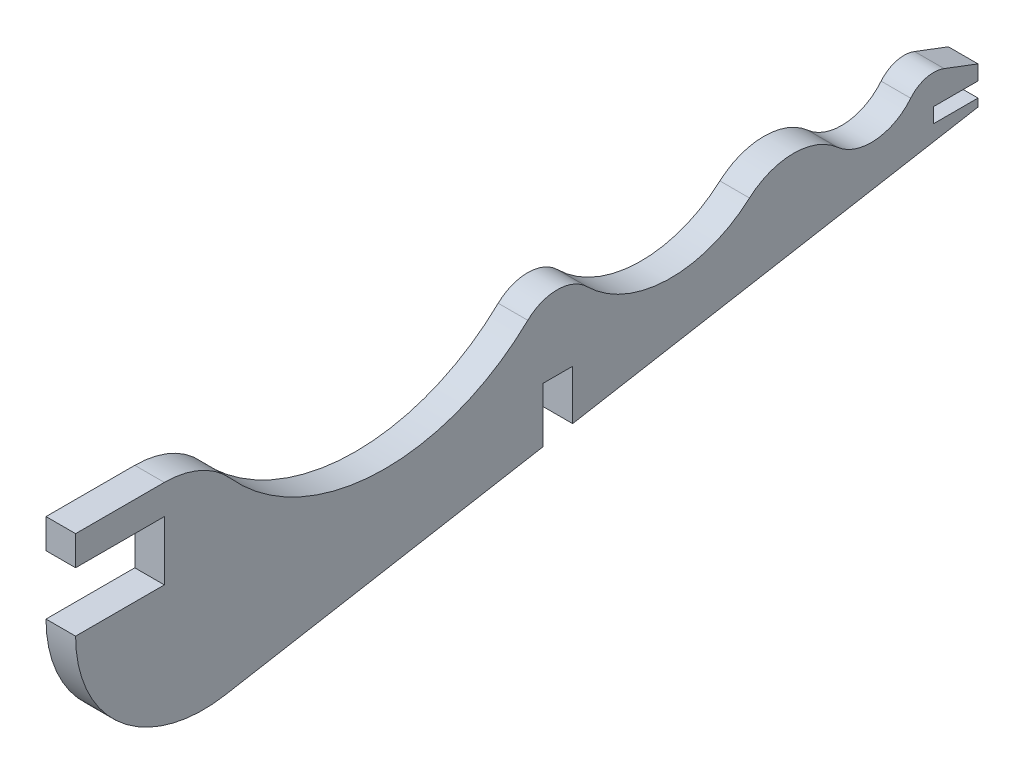
ISO-10303-21;
HEADER;
FILE_DESCRIPTION(('STEP AP214'),'2;1');
FILE_NAME('part.step','',(''),(''),'','','');
FILE_SCHEMA(('AUTOMOTIVE_DESIGN { 1 0 10303 214 1 1 1 1 }'));
ENDSEC;
DATA;
#1=APPLICATION_CONTEXT('core data for automotive mechanical design processes');
#2=APPLICATION_PROTOCOL_DEFINITION('international standard','automotive_design',2000,#1);
#3=PRODUCT_CONTEXT('',#1,'mechanical');
#4=PRODUCT('Part','Part','',(#3));
#5=PRODUCT_RELATED_PRODUCT_CATEGORY('part','',(#4));
#6=PRODUCT_DEFINITION_FORMATION('','',#4);
#7=PRODUCT_DEFINITION_CONTEXT('part definition',#1,'design');
#8=PRODUCT_DEFINITION('design','',#6,#7);
#9=PRODUCT_DEFINITION_SHAPE('','',#8);
#10=(LENGTH_UNIT() NAMED_UNIT(*) SI_UNIT(.MILLI.,.METRE.));
#11=(NAMED_UNIT(*) PLANE_ANGLE_UNIT() SI_UNIT($,.RADIAN.));
#12=(NAMED_UNIT(*) SI_UNIT($,.STERADIAN.) SOLID_ANGLE_UNIT());
#13=UNCERTAINTY_MEASURE_WITH_UNIT(LENGTH_MEASURE(1.E-05),#10,'distance_accuracy_value','');
#14=(GEOMETRIC_REPRESENTATION_CONTEXT(3) GLOBAL_UNCERTAINTY_ASSIGNED_CONTEXT((#13)) GLOBAL_UNIT_ASSIGNED_CONTEXT((#10,
#11,#12)) REPRESENTATION_CONTEXT('',''));
#15=CARTESIAN_POINT('',(0.,0.,0.));
#16=DIRECTION('',(0.,0.,1.));
#17=DIRECTION('',(1.,0.,0.));
#18=AXIS2_PLACEMENT_3D('',#15,#16,#17);
#19=CARTESIAN_POINT('',(6.35,-1.67951449124814,9.525));
#20=DIRECTION('',(0.,0.984807753012208,0.173648177666931));
#21=DIRECTION('',(0.,-0.173648177666931,0.984807753012208));
#22=AXIS2_PLACEMENT_3D('',#19,#20,#21);
#23=PLANE('',#22);
#24=DIRECTION('',(0.,0.173648177666931,-0.984807753012208));
#25=VECTOR('',#24,1.);
#26=CARTESIAN_POINT('',(6.35,-1.67951449124814,9.525));
#27=LINE('',#26,#25);
#28=CARTESIAN_POINT('',(6.35,-17.020078133679,96.5256596880061));
#29=VERTEX_POINT('',#28);
#30=CARTESIAN_POINT('',(6.35,-1.67951449124814,9.525));
#31=VERTEX_POINT('',#30);
#32=EDGE_CURVE('E303',#29,#31,#27,.T.);
#33=ORIENTED_EDGE('',*,*,#32,.F.);
#34=DIRECTION('',(-1.,0.,0.));
#35=VECTOR('',#34,1.);
#36=CARTESIAN_POINT('',(6.35,-17.020078133679,96.5256596880061));
#37=LINE('',#36,#35);
#38=CARTESIAN_POINT('',(0.,-17.020078133679,96.5256596880061));
#39=VERTEX_POINT('',#38);
#40=EDGE_CURVE('E326',#29,#39,#37,.T.);
#41=ORIENTED_EDGE('',*,*,#40,.T.);
#42=DIRECTION('',(0.,0.173648177666931,-0.984807753012208));
#43=VECTOR('',#42,1.);
#44=CARTESIAN_POINT('',(0.,-1.67951449124814,9.525));
#45=LINE('',#44,#43);
#46=CARTESIAN_POINT('',(0.,-1.67951449124814,9.525));
#47=VERTEX_POINT('',#46);
#48=EDGE_CURVE('E467',#39,#47,#45,.T.);
#49=ORIENTED_EDGE('',*,*,#48,.T.);
#50=DIRECTION('',(-1.,0.,0.));
#51=VECTOR('',#50,1.);
#52=CARTESIAN_POINT('',(6.35,-1.67951449124814,9.525));
#53=LINE('',#52,#51);
#54=EDGE_CURVE('E385',#31,#47,#53,.T.);
#55=ORIENTED_EDGE('',*,*,#54,.F.);
#56=EDGE_LOOP('',(#33,#41,#49,#55));
#57=FACE_BOUND('',#56,.T.);
#58=ADVANCED_FACE('F41',(#57),#23,.F.);
#59=CARTESIAN_POINT('',(6.35,0.,9.525));
#60=DIRECTION('',(0.,-1.,0.));
#61=DIRECTION('',(0.,0.,-1.));
#62=AXIS2_PLACEMENT_3D('',#59,#60,#61);
#63=PLANE('',#62);
#64=DIRECTION('',(0.,0.,1.));
#65=VECTOR('',#64,1.);
#66=CARTESIAN_POINT('',(0.,0.,9.525));
#67=LINE('',#66,#65);
#68=CARTESIAN_POINT('',(0.,0.,9.525));
#69=VERTEX_POINT('',#68);
#70=CARTESIAN_POINT('',(0.,0.,19.05));
#71=VERTEX_POINT('',#70);
#72=EDGE_CURVE('E436',#69,#71,#67,.T.);
#73=ORIENTED_EDGE('',*,*,#72,.T.);
#74=DIRECTION('',(-1.,0.,0.));
#75=VECTOR('',#74,1.);
#76=CARTESIAN_POINT('',(6.35,0.,19.05));
#77=LINE('',#76,#75);
#78=CARTESIAN_POINT('',(6.35,0.,19.05));
#79=VERTEX_POINT('',#78);
#80=EDGE_CURVE('E49',#79,#71,#77,.T.);
#81=ORIENTED_EDGE('',*,*,#80,.F.);
#82=DIRECTION('',(0.,0.,1.));
#83=VECTOR('',#82,1.);
#84=CARTESIAN_POINT('',(6.35,0.,9.525));
#85=LINE('',#84,#83);
#86=CARTESIAN_POINT('',(6.35,0.,9.525));
#87=VERTEX_POINT('',#86);
#88=EDGE_CURVE('E319',#87,#79,#85,.T.);
#89=ORIENTED_EDGE('',*,*,#88,.F.);
#90=DIRECTION('',(-1.,0.,0.));
#91=VECTOR('',#90,1.);
#92=CARTESIAN_POINT('',(6.35,0.,9.525));
#93=LINE('',#92,#91);
#94=EDGE_CURVE('E390',#87,#69,#93,.T.);
#95=ORIENTED_EDGE('',*,*,#94,.T.);
#96=EDGE_LOOP('',(#73,#81,#89,#95));
#97=FACE_BOUND('',#96,.T.);
#98=ADVANCED_FACE('F43',(#97),#63,.F.);
#99=CARTESIAN_POINT('',(6.35,0.,19.05));
#100=DIRECTION('',(0.,0.,1.));
#101=DIRECTION('',(1.,0.,0.));
#102=AXIS2_PLACEMENT_3D('',#99,#100,#101);
#103=PLANE('',#102);
#104=DIRECTION('',(0.,1.,0.));
#105=VECTOR('',#104,1.);
#106=CARTESIAN_POINT('',(0.,0.,19.05));
#107=LINE('',#106,#105);
#108=CARTESIAN_POINT('',(0.,3.175,19.05));
#109=VERTEX_POINT('',#108);
#110=EDGE_CURVE('E431',#71,#109,#107,.T.);
#111=ORIENTED_EDGE('',*,*,#110,.T.);
#112=DIRECTION('',(-1.,0.,0.));
#113=VECTOR('',#112,1.);
#114=CARTESIAN_POINT('',(6.35,3.175,19.05));
#115=LINE('',#114,#113);
#116=CARTESIAN_POINT('',(6.35,3.175,19.05));
#117=VERTEX_POINT('',#116);
#118=EDGE_CURVE('E339',#117,#109,#115,.T.);
#119=ORIENTED_EDGE('',*,*,#118,.F.);
#120=DIRECTION('',(0.,1.,0.));
#121=VECTOR('',#120,1.);
#122=CARTESIAN_POINT('',(6.35,0.,19.05));
#123=LINE('',#122,#121);
#124=EDGE_CURVE('E324',#79,#117,#123,.T.);
#125=ORIENTED_EDGE('',*,*,#124,.F.);
#126=ORIENTED_EDGE('',*,*,#80,.T.);
#127=EDGE_LOOP('',(#111,#119,#125,#126));
#128=FACE_BOUND('',#127,.T.);
#129=ADVANCED_FACE('F430',(#128),#103,.F.);
#130=CARTESIAN_POINT('',(6.35,3.175,19.05));
#131=DIRECTION('',(0.,1.,0.));
#132=DIRECTION('',(0.,0.,1.));
#133=AXIS2_PLACEMENT_3D('',#130,#131,#132);
#134=PLANE('',#133);
#135=DIRECTION('',(0.,0.,-1.));
#136=VECTOR('',#135,1.);
#137=CARTESIAN_POINT('',(0.,3.175,19.05));
#138=LINE('',#137,#136);
#139=CARTESIAN_POINT('',(0.,3.175,9.525));
#140=VERTEX_POINT('',#139);
#141=EDGE_CURVE('E340',#109,#140,#138,.T.);
#142=ORIENTED_EDGE('',*,*,#141,.T.);
#143=DIRECTION('',(1.,0.,0.));
#144=VECTOR('',#143,1.);
#145=CARTESIAN_POINT('',(0.,3.175,9.525));
#146=LINE('',#145,#144);
#147=CARTESIAN_POINT('',(6.35,3.175,9.525));
#148=VERTEX_POINT('',#147);
#149=EDGE_CURVE('E212',#140,#148,#146,.T.);
#150=ORIENTED_EDGE('',*,*,#149,.T.);
#151=DIRECTION('',(0.,0.,-1.));
#152=VECTOR('',#151,1.);
#153=CARTESIAN_POINT('',(6.35,3.175,19.05));
#154=LINE('',#153,#152);
#155=EDGE_CURVE('E245',#117,#148,#154,.T.);
#156=ORIENTED_EDGE('',*,*,#155,.F.);
#157=ORIENTED_EDGE('',*,*,#118,.T.);
#158=EDGE_LOOP('',(#142,#150,#156,#157));
#159=FACE_BOUND('',#158,.T.);
#160=ADVANCED_FACE('F338',(#159),#134,.F.);
#161=CARTESIAN_POINT('',(6.35,3.17499999999999,19.05));
#162=DIRECTION('',(-1.,0.,0.));
#163=DIRECTION('',(0.,0.,1.));
#164=AXIS2_PLACEMENT_3D('',#161,#162,#163);
#165=CYLINDRICAL_SURFACE('',#164,6.35);
#166=CARTESIAN_POINT('',(0.,3.17499999999999,19.05));
#167=DIRECTION('',(1.,0.,0.));
#168=DIRECTION('',(0.,0.,1.));
#169=AXIS2_PLACEMENT_3D('',#166,#167,#168);
#170=CIRCLE('',#169,6.35);
#171=CARTESIAN_POINT('',(0.,9.11127796000195,16.7954259866673));
#172=VERTEX_POINT('',#171);
#173=CARTESIAN_POINT('',(0.,7.19107525192554,23.9687030374756));
#174=VERTEX_POINT('',#173);
#175=EDGE_CURVE('E56',#172,#174,#170,.T.);
#176=ORIENTED_EDGE('',*,*,#175,.T.);
#177=DIRECTION('',(-1.,0.,0.));
#178=VECTOR('',#177,1.);
#179=CARTESIAN_POINT('',(6.35,7.19107525192554,23.9687030374756));
#180=LINE('',#179,#178);
#181=CARTESIAN_POINT('',(6.35,7.19107525192554,23.9687030374756));
#182=VERTEX_POINT('',#181);
#183=EDGE_CURVE('E423',#182,#174,#180,.T.);
#184=ORIENTED_EDGE('',*,*,#183,.F.);
#185=CARTESIAN_POINT('',(6.35,3.17499999999999,19.05));
#186=DIRECTION('',(1.,0.,0.));
#187=DIRECTION('',(0.,0.,1.));
#188=AXIS2_PLACEMENT_3D('',#185,#186,#187);
#189=CIRCLE('',#188,6.35);
#190=CARTESIAN_POINT('',(6.35,9.11127796000195,16.7954259866673));
#191=VERTEX_POINT('',#190);
#192=EDGE_CURVE('E240',#191,#182,#189,.T.);
#193=ORIENTED_EDGE('',*,*,#192,.F.);
#194=DIRECTION('',(1.,0.,0.));
#195=VECTOR('',#194,1.);
#196=CARTESIAN_POINT('',(0.,9.11127796000195,16.7954259866673));
#197=LINE('',#196,#195);
#198=EDGE_CURVE('E213',#172,#191,#197,.T.);
#199=ORIENTED_EDGE('',*,*,#198,.F.);
#200=EDGE_LOOP('',(#176,#184,#193,#199));
#201=FACE_BOUND('',#200,.T.);
#202=ADVANCED_FACE('F583',(#201),#165,.T.);
#203=CARTESIAN_POINT('',(6.35,14.1016924183254,32.4325070040233));
#204=DIRECTION('',(-1.,0.,0.));
#205=DIRECTION('',(0.,0.,1.));
#206=AXIS2_PLACEMENT_3D('',#203,#204,#205);
#207=CYLINDRICAL_SURFACE('',#206,10.9266924183254);
#208=CARTESIAN_POINT('',(0.,14.1016924183254,32.4325070040233));
#209=DIRECTION('',(-1.,0.,0.));
#210=DIRECTION('',(0.,0.,-1.));
#211=AXIS2_PLACEMENT_3D('',#208,#209,#210);
#212=CIRCLE('',#211,10.9266924183254);
#213=CARTESIAN_POINT('',(0.,5.93609250937455,39.6930569371641));
#214=VERTEX_POINT('',#213);
#215=EDGE_CURVE('E444',#174,#214,#212,.T.);
#216=ORIENTED_EDGE('',*,*,#215,.T.);
#217=DIRECTION('',(-1.,0.,0.));
#218=VECTOR('',#217,1.);
#219=CARTESIAN_POINT('',(6.35,5.93609250937455,39.6930569371641));
#220=LINE('',#219,#218);
#221=CARTESIAN_POINT('',(6.35,5.93609250937455,39.6930569371641));
#222=VERTEX_POINT('',#221);
#223=EDGE_CURVE('E420',#222,#214,#220,.T.);
#224=ORIENTED_EDGE('',*,*,#223,.F.);
#225=CARTESIAN_POINT('',(6.35,14.1016924183254,32.4325070040233));
#226=DIRECTION('',(-1.,0.,0.));
#227=DIRECTION('',(0.,0.,-1.));
#228=AXIS2_PLACEMENT_3D('',#225,#226,#227);
#229=CIRCLE('',#228,10.9266924183254);
#230=EDGE_CURVE('E244',#182,#222,#229,.T.);
#231=ORIENTED_EDGE('',*,*,#230,.F.);
#232=ORIENTED_EDGE('',*,*,#183,.T.);
#233=EDGE_LOOP('',(#216,#224,#231,#232));
#234=FACE_BOUND('',#233,.T.);
#235=ADVANCED_FACE('F579',(#234),#207,.F.);
#236=CARTESIAN_POINT('',(6.35,-4.67767091187443,49.1304234696647));
#237=DIRECTION('',(-1.,0.,0.));
#238=DIRECTION('',(0.,0.,1.));
#239=AXIS2_PLACEMENT_3D('',#236,#237,#238);
#240=CYLINDRICAL_SURFACE('',#239,14.2026709118744);
#241=CARTESIAN_POINT('',(0.,-4.67767091187443,49.1304234696647));
#242=DIRECTION('',(1.,0.,0.));
#243=DIRECTION('',(0.,0.,1.));
#244=AXIS2_PLACEMENT_3D('',#241,#242,#243);
#245=CIRCLE('',#244,14.2026709118744);
#246=CARTESIAN_POINT('',(0.,5.93843431338502,58.565155626818));
#247=VERTEX_POINT('',#246);
#248=EDGE_CURVE('E446',#214,#247,#245,.T.);
#249=ORIENTED_EDGE('',*,*,#248,.T.);
#250=DIRECTION('',(-1.,0.,0.));
#251=VECTOR('',#250,1.);
#252=CARTESIAN_POINT('',(6.35,5.93843431338502,58.565155626818));
#253=LINE('',#252,#251);
#254=CARTESIAN_POINT('',(6.35,5.93843431338502,58.565155626818));
#255=VERTEX_POINT('',#254);
#256=EDGE_CURVE('E417',#255,#247,#253,.T.);
#257=ORIENTED_EDGE('',*,*,#256,.F.);
#258=CARTESIAN_POINT('',(6.35,-4.67767091187443,49.1304234696647));
#259=DIRECTION('',(1.,0.,0.));
#260=DIRECTION('',(0.,0.,1.));
#261=AXIS2_PLACEMENT_3D('',#258,#259,#260);
#262=CIRCLE('',#261,14.2026709118744);
#263=EDGE_CURVE('E250',#222,#255,#262,.T.);
#264=ORIENTED_EDGE('',*,*,#263,.F.);
#265=ORIENTED_EDGE('',*,*,#223,.T.);
#266=EDGE_LOOP('',(#249,#257,#264,#265));
#267=FACE_BOUND('',#266,.T.);
#268=ADVANCED_FACE('F576',(#267),#240,.T.);
#269=CARTESIAN_POINT('',(6.35,24.9797424399765,75.4875238856374));
#270=DIRECTION('',(-1.,0.,0.));
#271=DIRECTION('',(0.,0.,1.));
#272=AXIS2_PLACEMENT_3D('',#269,#270,#271);
#273=CYLINDRICAL_SURFACE('',#272,25.4742607872907);
#274=CARTESIAN_POINT('',(0.,24.9797424399765,75.4875238856374));
#275=DIRECTION('',(-1.,0.,0.));
#276=DIRECTION('',(0.,0.,1.));
#277=AXIS2_PLACEMENT_3D('',#274,#275,#276);
#278=CIRCLE('',#277,25.4742607872907);
#279=CARTESIAN_POINT('',(0.,6.88009994266379,93.4135079347313));
#280=VERTEX_POINT('',#279);
#281=EDGE_CURVE('E448',#247,#280,#278,.T.);
#282=ORIENTED_EDGE('',*,*,#281,.T.);
#283=DIRECTION('',(-1.,0.,0.));
#284=VECTOR('',#283,1.);
#285=CARTESIAN_POINT('',(6.35,6.88009994266379,93.4135079347313));
#286=LINE('',#285,#284);
#287=CARTESIAN_POINT('',(6.35,6.88009994266379,93.4135079347313));
#288=VERTEX_POINT('',#287);
#289=EDGE_CURVE('E414',#288,#280,#286,.T.);
#290=ORIENTED_EDGE('',*,*,#289,.F.);
#291=CARTESIAN_POINT('',(6.35,24.9797424399765,75.4875238856374));
#292=DIRECTION('',(-1.,0.,0.));
#293=DIRECTION('',(0.,0.,1.));
#294=AXIS2_PLACEMENT_3D('',#291,#292,#293);
#295=CIRCLE('',#294,25.4742607872907);
#296=EDGE_CURVE('E254',#255,#288,#295,.T.);
#297=ORIENTED_EDGE('',*,*,#296,.F.);
#298=ORIENTED_EDGE('',*,*,#256,.T.);
#299=EDGE_LOOP('',(#282,#290,#297,#298));
#300=FACE_BOUND('',#299,.T.);
#301=ADVANCED_FACE('F493',(#300),#273,.F.);
#302=CARTESIAN_POINT('',(6.35,0.388679831610244,99.8426456032787));
#303=DIRECTION('',(-1.,0.,0.));
#304=DIRECTION('',(0.,0.,1.));
#305=AXIS2_PLACEMENT_3D('',#302,#303,#304);
#306=CYLINDRICAL_SURFACE('',#305,9.13632016838976);
#307=CARTESIAN_POINT('',(0.,0.388679831610244,99.8426456032787));
#308=DIRECTION('',(1.,0.,0.));
#309=DIRECTION('',(0.,0.,-1.));
#310=AXIS2_PLACEMENT_3D('',#307,#308,#309);
#311=CIRCLE('',#310,9.13632016838976);
#312=CARTESIAN_POINT('',(0.,7.00063718188849,106.147751963795));
#313=VERTEX_POINT('',#312);
#314=EDGE_CURVE('E450',#280,#313,#311,.T.);
#315=ORIENTED_EDGE('',*,*,#314,.T.);
#316=DIRECTION('',(-1.,0.,0.));
#317=VECTOR('',#316,1.);
#318=CARTESIAN_POINT('',(6.35,7.00063718188849,106.147751963795));
#319=LINE('',#318,#317);
#320=CARTESIAN_POINT('',(6.35,7.00063718188849,106.147751963795));
#321=VERTEX_POINT('',#320);
#322=EDGE_CURVE('E411',#321,#313,#319,.T.);
#323=ORIENTED_EDGE('',*,*,#322,.F.);
#324=CARTESIAN_POINT('',(6.35,0.388679831610244,99.8426456032787));
#325=DIRECTION('',(1.,0.,0.));
#326=DIRECTION('',(0.,0.,-1.));
#327=AXIS2_PLACEMENT_3D('',#324,#325,#326);
#328=CIRCLE('',#327,9.13632016838976);
#329=EDGE_CURVE('E262',#288,#321,#328,.T.);
#330=ORIENTED_EDGE('',*,*,#329,.F.);
#331=ORIENTED_EDGE('',*,*,#289,.T.);
#332=EDGE_LOOP('',(#315,#323,#330,#331));
#333=FACE_BOUND('',#332,.T.);
#334=ADVANCED_FACE('F497',(#333),#306,.T.);
#335=CARTESIAN_POINT('',(6.35,39.1691140744477,136.823338256691));
#336=DIRECTION('',(-1.,0.,0.));
#337=DIRECTION('',(0.,0.,1.));
#338=AXIS2_PLACEMENT_3D('',#335,#336,#337);
#339=CYLINDRICAL_SURFACE('',#338,44.45);
#340=CARTESIAN_POINT('',(0.,39.1691140744477,136.823338256691));
#341=DIRECTION('',(-1.,0.,0.));
#342=DIRECTION('',(0.,0.,1.));
#343=AXIS2_PLACEMENT_3D('',#340,#341,#342);
#344=CIRCLE('',#343,44.45);
#345=CARTESIAN_POINT('',(0.,9.52499999999999,169.944766377186));
#346=VERTEX_POINT('',#345);
#347=EDGE_CURVE('E452',#313,#346,#344,.T.);
#348=ORIENTED_EDGE('',*,*,#347,.T.);
#349=DIRECTION('',(-1.,0.,0.));
#350=VECTOR('',#349,1.);
#351=CARTESIAN_POINT('',(6.35,9.52499999999999,169.944766377186));
#352=LINE('',#351,#350);
#353=CARTESIAN_POINT('',(6.35,9.52499999999999,169.944766377186));
#354=VERTEX_POINT('',#353);
#355=EDGE_CURVE('E408',#354,#346,#352,.T.);
#356=ORIENTED_EDGE('',*,*,#355,.F.);
#357=CARTESIAN_POINT('',(6.35,39.1691140744477,136.823338256691));
#358=DIRECTION('',(-1.,0.,0.));
#359=DIRECTION('',(0.,0.,1.));
#360=AXIS2_PLACEMENT_3D('',#357,#358,#359);
#361=CIRCLE('',#360,44.45);
#362=EDGE_CURVE('E265',#321,#354,#361,.T.);
#363=ORIENTED_EDGE('',*,*,#362,.F.);
#364=ORIENTED_EDGE('',*,*,#322,.T.);
#365=EDGE_LOOP('',(#348,#356,#363,#364));
#366=FACE_BOUND('',#365,.T.);
#367=ADVANCED_FACE('F502',(#366),#339,.F.);
#368=CARTESIAN_POINT('',(6.35,-3.18887104556342,184.15));
#369=DIRECTION('',(-1.,0.,0.));
#370=DIRECTION('',(0.,0.,1.));
#371=AXIS2_PLACEMENT_3D('',#368,#369,#370);
#372=CYLINDRICAL_SURFACE('',#371,19.0638710455652);
#373=CARTESIAN_POINT('',(0.,-3.18887104556342,184.15));
#374=DIRECTION('',(1.,0.,0.));
#375=DIRECTION('',(0.,0.,-1.));
#376=AXIS2_PLACEMENT_3D('',#373,#374,#375);
#377=CIRCLE('',#376,19.0638710455652);
#378=CARTESIAN_POINT('',(0.,15.8750000000017,184.15));
#379=VERTEX_POINT('',#378);
#380=EDGE_CURVE('E454',#346,#379,#377,.T.);
#381=ORIENTED_EDGE('',*,*,#380,.T.);
#382=DIRECTION('',(-1.,0.,0.));
#383=VECTOR('',#382,1.);
#384=CARTESIAN_POINT('',(6.35,15.8750000000017,184.15));
#385=LINE('',#384,#383);
#386=CARTESIAN_POINT('',(6.35,15.8750000000017,184.15));
#387=VERTEX_POINT('',#386);
#388=EDGE_CURVE('E405',#387,#379,#385,.T.);
#389=ORIENTED_EDGE('',*,*,#388,.F.);
#390=CARTESIAN_POINT('',(6.35,-3.18887104556342,184.15));
#391=DIRECTION('',(1.,0.,0.));
#392=DIRECTION('',(0.,0.,-1.));
#393=AXIS2_PLACEMENT_3D('',#390,#391,#392);
#394=CIRCLE('',#393,19.0638710455652);
#395=EDGE_CURVE('E269',#354,#387,#394,.T.);
#396=ORIENTED_EDGE('',*,*,#395,.F.);
#397=ORIENTED_EDGE('',*,*,#355,.T.);
#398=EDGE_LOOP('',(#381,#389,#396,#397));
#399=FACE_BOUND('',#398,.T.);
#400=ADVANCED_FACE('F508',(#399),#372,.T.);
#401=CARTESIAN_POINT('',(6.35,15.8750000000017,203.2));
#402=DIRECTION('',(0.,-1.,0.));
#403=DIRECTION('',(0.,0.,-1.));
#404=AXIS2_PLACEMENT_3D('',#401,#402,#403);
#405=PLANE('',#404);
#406=DIRECTION('',(0.,0.,1.));
#407=VECTOR('',#406,1.);
#408=CARTESIAN_POINT('',(0.,15.8750000000017,203.2));
#409=LINE('',#408,#407);
#410=CARTESIAN_POINT('',(0.,15.8750000000017,203.2));
#411=VERTEX_POINT('',#410);
#412=EDGE_CURVE('E456',#379,#411,#409,.T.);
#413=ORIENTED_EDGE('',*,*,#412,.T.);
#414=DIRECTION('',(-1.,0.,0.));
#415=VECTOR('',#414,1.);
#416=CARTESIAN_POINT('',(6.35,15.8750000000017,203.2));
#417=LINE('',#416,#415);
#418=CARTESIAN_POINT('',(6.35,15.8750000000017,203.2));
#419=VERTEX_POINT('',#418);
#420=EDGE_CURVE('E402',#419,#411,#417,.T.);
#421=ORIENTED_EDGE('',*,*,#420,.F.);
#422=DIRECTION('',(0.,0.,1.));
#423=VECTOR('',#422,1.);
#424=CARTESIAN_POINT('',(6.35,15.8750000000017,203.2));
#425=LINE('',#424,#423);
#426=EDGE_CURVE('E273',#387,#419,#425,.T.);
#427=ORIENTED_EDGE('',*,*,#426,.F.);
#428=ORIENTED_EDGE('',*,*,#388,.T.);
#429=EDGE_LOOP('',(#413,#421,#427,#428));
#430=FACE_BOUND('',#429,.T.);
#431=ADVANCED_FACE('F512',(#430),#405,.F.);
#432=CARTESIAN_POINT('',(6.35,9.525,203.2));
#433=DIRECTION('',(0.,0.,-1.));
#434=DIRECTION('',(-1.,0.,0.));
#435=AXIS2_PLACEMENT_3D('',#432,#433,#434);
#436=PLANE('',#435);
#437=DIRECTION('',(0.,-1.,0.));
#438=VECTOR('',#437,1.);
#439=CARTESIAN_POINT('',(0.,9.525,203.2));
#440=LINE('',#439,#438);
#441=CARTESIAN_POINT('',(0.,9.525,203.2));
#442=VERTEX_POINT('',#441);
#443=EDGE_CURVE('E458',#411,#442,#440,.T.);
#444=ORIENTED_EDGE('',*,*,#443,.T.);
#445=DIRECTION('',(-1.,0.,0.));
#446=VECTOR('',#445,1.);
#447=CARTESIAN_POINT('',(6.35,9.525,203.2));
#448=LINE('',#447,#446);
#449=CARTESIAN_POINT('',(6.35,9.525,203.2));
#450=VERTEX_POINT('',#449);
#451=EDGE_CURVE('E399',#450,#442,#448,.T.);
#452=ORIENTED_EDGE('',*,*,#451,.F.);
#453=DIRECTION('',(0.,-1.,0.));
#454=VECTOR('',#453,1.);
#455=CARTESIAN_POINT('',(6.35,9.525,203.2));
#456=LINE('',#455,#454);
#457=EDGE_CURVE('E281',#419,#450,#456,.T.);
#458=ORIENTED_EDGE('',*,*,#457,.F.);
#459=ORIENTED_EDGE('',*,*,#420,.T.);
#460=EDGE_LOOP('',(#444,#452,#458,#459));
#461=FACE_BOUND('',#460,.T.);
#462=ADVANCED_FACE('F517',(#461),#436,.F.);
#463=CARTESIAN_POINT('',(6.35,9.525,203.2));
#464=DIRECTION('',(0.,1.,0.));
#465=DIRECTION('',(0.,0.,1.));
#466=AXIS2_PLACEMENT_3D('',#463,#464,#465);
#467=PLANE('',#466);
#468=DIRECTION('',(0.,0.,-1.));
#469=VECTOR('',#468,1.);
#470=CARTESIAN_POINT('',(0.,9.525,203.2));
#471=LINE('',#470,#469);
#472=CARTESIAN_POINT('',(0.,9.52499999999997,184.15));
#473=VERTEX_POINT('',#472);
#474=EDGE_CURVE('E460',#442,#473,#471,.T.);
#475=ORIENTED_EDGE('',*,*,#474,.T.);
#476=DIRECTION('',(-1.,0.,0.));
#477=VECTOR('',#476,1.);
#478=CARTESIAN_POINT('',(6.35,9.52499999999997,184.15));
#479=LINE('',#478,#477);
#480=CARTESIAN_POINT('',(6.35,9.52499999999997,184.15));
#481=VERTEX_POINT('',#480);
#482=EDGE_CURVE('E396',#481,#473,#479,.T.);
#483=ORIENTED_EDGE('',*,*,#482,.F.);
#484=DIRECTION('',(0.,0.,-1.));
#485=VECTOR('',#484,1.);
#486=CARTESIAN_POINT('',(6.35,9.525,203.2));
#487=LINE('',#486,#485);
#488=EDGE_CURVE('E284',#450,#481,#487,.T.);
#489=ORIENTED_EDGE('',*,*,#488,.F.);
#490=ORIENTED_EDGE('',*,*,#451,.T.);
#491=EDGE_LOOP('',(#475,#483,#489,#490));
#492=FACE_BOUND('',#491,.T.);
#493=ADVANCED_FACE('F523',(#492),#467,.F.);
#494=CARTESIAN_POINT('',(6.35,9.52499999999997,184.15));
#495=DIRECTION('',(0.,0.,-1.));
#496=DIRECTION('',(0.,1.,0.));
#497=AXIS2_PLACEMENT_3D('',#494,#495,#496);
#498=PLANE('',#497);
#499=DIRECTION('',(0.,-1.,0.));
#500=VECTOR('',#499,1.);
#501=CARTESIAN_POINT('',(0.,9.52499999999997,184.15));
#502=LINE('',#501,#500);
#503=CARTESIAN_POINT('',(0.,-3.17500000000002,184.15));
#504=VERTEX_POINT('',#503);
#505=EDGE_CURVE('E462',#473,#504,#502,.T.);
#506=ORIENTED_EDGE('',*,*,#505,.T.);
#507=DIRECTION('',(-1.,0.,0.));
#508=VECTOR('',#507,1.);
#509=CARTESIAN_POINT('',(6.35,-3.17500000000002,184.15));
#510=LINE('',#509,#508);
#511=CARTESIAN_POINT('',(6.35,-3.17500000000002,184.15));
#512=VERTEX_POINT('',#511);
#513=EDGE_CURVE('E387',#512,#504,#510,.T.);
#514=ORIENTED_EDGE('',*,*,#513,.F.);
#515=DIRECTION('',(0.,-1.,0.));
#516=VECTOR('',#515,1.);
#517=CARTESIAN_POINT('',(6.35,9.52499999999997,184.15));
#518=LINE('',#517,#516);
#519=EDGE_CURVE('E288',#481,#512,#518,.T.);
#520=ORIENTED_EDGE('',*,*,#519,.F.);
#521=ORIENTED_EDGE('',*,*,#482,.T.);
#522=EDGE_LOOP('',(#506,#514,#520,#521));
#523=FACE_BOUND('',#522,.T.);
#524=ADVANCED_FACE('F527',(#523),#498,.F.);
#525=CARTESIAN_POINT('',(6.35,-3.17500000000002,184.15));
#526=DIRECTION('',(0.,-1.,-1.81850014778251E-13));
#527=DIRECTION('',(0.,1.81850014778251E-13,-1.));
#528=AXIS2_PLACEMENT_3D('',#525,#526,#527);
#529=PLANE('',#528);
#530=DIRECTION('',(0.,-1.81850014778251E-13,1.));
#531=VECTOR('',#530,1.);
#532=CARTESIAN_POINT('',(0.,-3.17500000000002,184.15));
#533=LINE('',#532,#531);
#534=CARTESIAN_POINT('',(0.,-3.17500000000349,203.2));
#535=VERTEX_POINT('',#534);
#536=EDGE_CURVE('E464',#504,#535,#533,.T.);
#537=ORIENTED_EDGE('',*,*,#536,.T.);
#538=DIRECTION('',(-1.,0.,0.));
#539=VECTOR('',#538,1.);
#540=CARTESIAN_POINT('',(6.35,-3.17500000000349,203.2));
#541=LINE('',#540,#539);
#542=CARTESIAN_POINT('',(6.35,-3.17500000000349,203.2));
#543=VERTEX_POINT('',#542);
#544=EDGE_CURVE('E384',#543,#535,#541,.T.);
#545=ORIENTED_EDGE('',*,*,#544,.F.);
#546=DIRECTION('',(0.,-1.81850014778251E-13,1.));
#547=VECTOR('',#546,1.);
#548=CARTESIAN_POINT('',(6.35,-3.17500000000002,184.15));
#549=LINE('',#548,#547);
#550=EDGE_CURVE('E292',#512,#543,#549,.T.);
#551=ORIENTED_EDGE('',*,*,#550,.F.);
#552=ORIENTED_EDGE('',*,*,#513,.T.);
#553=EDGE_LOOP('',(#537,#545,#551,#552));
#554=FACE_BOUND('',#553,.T.);
#555=ADVANCED_FACE('F530',(#554),#529,.F.);
#556=CARTESIAN_POINT('',(6.35,-3.17500000000349,175.799501538842));
#557=DIRECTION('',(-1.,0.,0.));
#558=DIRECTION('',(0.,0.,1.));
#559=AXIS2_PLACEMENT_3D('',#556,#557,#558);
#560=CYLINDRICAL_SURFACE('',#559,27.4004984611576);
#561=CARTESIAN_POINT('',(0.,-3.17500000000349,175.799501538842));
#562=DIRECTION('',(1.,0.,0.));
#563=DIRECTION('',(0.,0.,-1.));
#564=AXIS2_PLACEMENT_3D('',#561,#562,#563);
#565=CIRCLE('',#564,27.4004984611576);
#566=CARTESIAN_POINT('',(0.,-30.1592233209506,171.041454913897));
#567=VERTEX_POINT('',#566);
#568=EDGE_CURVE('E383',#535,#567,#565,.T.);
#569=ORIENTED_EDGE('',*,*,#568,.T.);
#570=DIRECTION('',(-1.,0.,0.));
#571=VECTOR('',#570,1.);
#572=CARTESIAN_POINT('',(6.35,-30.1592233209506,171.041454913897));
#573=LINE('',#572,#571);
#574=CARTESIAN_POINT('',(6.35,-30.1592233209506,171.041454913897));
#575=VERTEX_POINT('',#574);
#576=EDGE_CURVE('E380',#575,#567,#573,.T.);
#577=ORIENTED_EDGE('',*,*,#576,.F.);
#578=CARTESIAN_POINT('',(6.35,-3.17500000000349,175.799501538842));
#579=DIRECTION('',(1.,0.,0.));
#580=DIRECTION('',(0.,0.,-1.));
#581=AXIS2_PLACEMENT_3D('',#578,#579,#580);
#582=CIRCLE('',#581,27.4004984611576);
#583=EDGE_CURVE('E300',#543,#575,#582,.T.);
#584=ORIENTED_EDGE('',*,*,#583,.F.);
#585=ORIENTED_EDGE('',*,*,#544,.T.);
#586=EDGE_LOOP('',(#569,#577,#584,#585));
#587=FACE_BOUND('',#586,.T.);
#588=ADVANCED_FACE('F381',(#587),#560,.T.);
#589=CARTESIAN_POINT('',(0.,-18.1397544611777,102.875659688006));
#590=VERTEX_POINT('',#589);
#591=EDGE_CURVE('E369',#567,#590,#45,.T.);
#592=ORIENTED_EDGE('',*,*,#591,.T.);
#593=DIRECTION('',(1.,0.,0.));
#594=VECTOR('',#593,1.);
#595=CARTESIAN_POINT('',(0.,-18.1397544611777,102.875659688006));
#596=LINE('',#595,#594);
#597=CARTESIAN_POINT('',(6.35,-18.1397544611777,102.875659688006));
#598=VERTEX_POINT('',#597);
#599=EDGE_CURVE('E351',#590,#598,#596,.T.);
#600=ORIENTED_EDGE('',*,*,#599,.T.);
#601=EDGE_CURVE('E304',#575,#598,#27,.T.);
#602=ORIENTED_EDGE('',*,*,#601,.F.);
#603=ORIENTED_EDGE('',*,*,#576,.T.);
#604=EDGE_LOOP('',(#592,#600,#602,#603));
#605=FACE_BOUND('',#604,.T.);
#606=ADVANCED_FACE('F366',(#605),#23,.F.);
#607=CARTESIAN_POINT('',(6.35,0.,9.525));
#608=DIRECTION('',(0.,0.,1.));
#609=DIRECTION('',(1.,0.,0.));
#610=AXIS2_PLACEMENT_3D('',#607,#608,#609);
#611=PLANE('',#610);
#612=DIRECTION('',(0.,1.,0.));
#613=VECTOR('',#612,1.);
#614=CARTESIAN_POINT('',(0.,0.,9.525));
#615=LINE('',#614,#613);
#616=EDGE_CURVE('E325',#47,#69,#615,.T.);
#617=ORIENTED_EDGE('',*,*,#616,.T.);
#618=ORIENTED_EDGE('',*,*,#94,.F.);
#619=DIRECTION('',(0.,1.,0.));
#620=VECTOR('',#619,1.);
#621=CARTESIAN_POINT('',(6.35,0.,9.525));
#622=LINE('',#621,#620);
#623=EDGE_CURVE('E309',#31,#87,#622,.T.);
#624=ORIENTED_EDGE('',*,*,#623,.F.);
#625=ORIENTED_EDGE('',*,*,#54,.T.);
#626=EDGE_LOOP('',(#617,#618,#624,#625));
#627=FACE_BOUND('',#626,.T.);
#628=ADVANCED_FACE('F476',(#627),#611,.F.);
#629=CARTESIAN_POINT('',(6.35,3.17499999999999,19.05));
#630=DIRECTION('',(-1.,0.,0.));
#631=DIRECTION('',(0.,0.,1.));
#632=AXIS2_PLACEMENT_3D('',#629,#630,#631);
#633=PLANE('',#632);
#634=ORIENTED_EDGE('',*,*,#155,.T.);
#635=DIRECTION('',(0.,-1.,0.));
#636=VECTOR('',#635,1.);
#637=CARTESIAN_POINT('',(6.35,3.175,9.525));
#638=LINE('',#637,#636);
#639=CARTESIAN_POINT('',(6.35,6.35,9.525));
#640=VERTEX_POINT('',#639);
#641=EDGE_CURVE('E223',#640,#148,#638,.T.);
#642=ORIENTED_EDGE('',*,*,#641,.F.);
#643=DIRECTION('',(0.,-0.355051025721682,-0.934846922834954));
#644=VECTOR('',#643,1.);
#645=CARTESIAN_POINT('',(6.35,9.11127796000195,16.7954259866673));
#646=LINE('',#645,#644);
#647=EDGE_CURVE('E209',#191,#640,#646,.T.);
#648=ORIENTED_EDGE('',*,*,#647,.F.);
#649=ORIENTED_EDGE('',*,*,#192,.T.);
#650=ORIENTED_EDGE('',*,*,#230,.T.);
#651=ORIENTED_EDGE('',*,*,#263,.T.);
#652=ORIENTED_EDGE('',*,*,#296,.T.);
#653=ORIENTED_EDGE('',*,*,#329,.T.);
#654=ORIENTED_EDGE('',*,*,#362,.T.);
#655=ORIENTED_EDGE('',*,*,#395,.T.);
#656=ORIENTED_EDGE('',*,*,#426,.T.);
#657=ORIENTED_EDGE('',*,*,#457,.T.);
#658=ORIENTED_EDGE('',*,*,#488,.T.);
#659=ORIENTED_EDGE('',*,*,#519,.T.);
#660=ORIENTED_EDGE('',*,*,#550,.T.);
#661=ORIENTED_EDGE('',*,*,#583,.T.);
#662=ORIENTED_EDGE('',*,*,#601,.T.);
#663=DIRECTION('',(0.,-1.,0.));
#664=VECTOR('',#663,1.);
#665=CARTESIAN_POINT('',(6.35,-6.35000000000175,102.875659688006));
#666=LINE('',#665,#664);
#667=CARTESIAN_POINT('',(6.35,-6.35000000000175,102.875659688006));
#668=VERTEX_POINT('',#667);
#669=EDGE_CURVE('E341',#668,#598,#666,.T.);
#670=ORIENTED_EDGE('',*,*,#669,.F.);
#671=DIRECTION('',(0.,0.,1.));
#672=VECTOR('',#671,1.);
#673=CARTESIAN_POINT('',(6.35,-6.35000000000175,96.5256596880061));
#674=LINE('',#673,#672);
#675=CARTESIAN_POINT('',(6.35,-6.35000000000175,96.5256596880061));
#676=VERTEX_POINT('',#675);
#677=EDGE_CURVE('E350',#676,#668,#674,.T.);
#678=ORIENTED_EDGE('',*,*,#677,.F.);
#679=DIRECTION('',(0.,1.,0.));
#680=VECTOR('',#679,1.);
#681=CARTESIAN_POINT('',(6.35,-6.35000000000175,96.5256596880061));
#682=LINE('',#681,#680);
#683=EDGE_CURVE('E343',#29,#676,#682,.T.);
#684=ORIENTED_EDGE('',*,*,#683,.F.);
#685=ORIENTED_EDGE('',*,*,#32,.T.);
#686=ORIENTED_EDGE('',*,*,#623,.T.);
#687=ORIENTED_EDGE('',*,*,#88,.T.);
#688=ORIENTED_EDGE('',*,*,#124,.T.);
#689=EDGE_LOOP('',(#634,#642,#648,#649,#650,#651,#652,#653,#654,#655,#656,#657,#658,#659,#660,
#661,#662,#670,#678,#684,#685,#686,#687,#688));
#690=FACE_BOUND('',#689,.T.);
#691=ADVANCED_FACE('F335',(#690),#633,.F.);
#692=CARTESIAN_POINT('',(0.,3.17499999999999,19.05));
#693=DIRECTION('',(-1.,0.,0.));
#694=DIRECTION('',(0.,0.,1.));
#695=AXIS2_PLACEMENT_3D('',#692,#693,#694);
#696=PLANE('',#695);
#697=DIRECTION('',(0.,-1.,0.));
#698=VECTOR('',#697,1.);
#699=CARTESIAN_POINT('',(0.,3.175,9.525));
#700=LINE('',#699,#698);
#701=CARTESIAN_POINT('',(0.,6.35,9.525));
#702=VERTEX_POINT('',#701);
#703=EDGE_CURVE('E216',#702,#140,#700,.T.);
#704=ORIENTED_EDGE('',*,*,#703,.T.);
#705=ORIENTED_EDGE('',*,*,#141,.F.);
#706=ORIENTED_EDGE('',*,*,#110,.F.);
#707=ORIENTED_EDGE('',*,*,#72,.F.);
#708=ORIENTED_EDGE('',*,*,#616,.F.);
#709=ORIENTED_EDGE('',*,*,#48,.F.);
#710=DIRECTION('',(0.,-1.,0.));
#711=VECTOR('',#710,1.);
#712=CARTESIAN_POINT('',(0.,3.17499999999999,96.5256596880061));
#713=LINE('',#712,#711);
#714=CARTESIAN_POINT('',(0.,-6.35000000000175,96.5256596880061));
#715=VERTEX_POINT('',#714);
#716=EDGE_CURVE('E12',#715,#39,#713,.T.);
#717=ORIENTED_EDGE('',*,*,#716,.F.);
#718=DIRECTION('',(0.,0.,1.));
#719=VECTOR('',#718,1.);
#720=CARTESIAN_POINT('',(0.,-6.35000000000175,96.5256596880061));
#721=LINE('',#720,#719);
#722=CARTESIAN_POINT('',(0.,-6.35000000000175,102.875659688006));
#723=VERTEX_POINT('',#722);
#724=EDGE_CURVE('E64',#715,#723,#721,.T.);
#725=ORIENTED_EDGE('',*,*,#724,.T.);
#726=DIRECTION('',(0.,-1.,0.));
#727=VECTOR('',#726,1.);
#728=CARTESIAN_POINT('',(0.,-6.35000000000175,102.875659688006));
#729=LINE('',#728,#727);
#730=EDGE_CURVE('E347',#723,#590,#729,.T.);
#731=ORIENTED_EDGE('',*,*,#730,.T.);
#732=ORIENTED_EDGE('',*,*,#591,.F.);
#733=ORIENTED_EDGE('',*,*,#568,.F.);
#734=ORIENTED_EDGE('',*,*,#536,.F.);
#735=ORIENTED_EDGE('',*,*,#505,.F.);
#736=ORIENTED_EDGE('',*,*,#474,.F.);
#737=ORIENTED_EDGE('',*,*,#443,.F.);
#738=ORIENTED_EDGE('',*,*,#412,.F.);
#739=ORIENTED_EDGE('',*,*,#380,.F.);
#740=ORIENTED_EDGE('',*,*,#347,.F.);
#741=ORIENTED_EDGE('',*,*,#314,.F.);
#742=ORIENTED_EDGE('',*,*,#281,.F.);
#743=ORIENTED_EDGE('',*,*,#248,.F.);
#744=ORIENTED_EDGE('',*,*,#215,.F.);
#745=ORIENTED_EDGE('',*,*,#175,.F.);
#746=DIRECTION('',(0.,-0.355051025721682,-0.934846922834954));
#747=VECTOR('',#746,1.);
#748=CARTESIAN_POINT('',(0.,9.11127796000195,16.7954259866673));
#749=LINE('',#748,#747);
#750=EDGE_CURVE('E206',#172,#702,#749,.T.);
#751=ORIENTED_EDGE('',*,*,#750,.T.);
#752=EDGE_LOOP('',(#704,#705,#706,#707,#708,#709,#717,#725,#731,#732,#733,#734,#735,#736,#737,
#738,#739,#740,#741,#742,#743,#744,#745,#751));
#753=FACE_BOUND('',#752,.T.);
#754=ADVANCED_FACE('F222',(#753),#696,.T.);
#755=CARTESIAN_POINT('',(0.,-6.35000000000175,96.5256596880061));
#756=DIRECTION('',(0.,0.,-1.));
#757=DIRECTION('',(-1.,0.,0.));
#758=AXIS2_PLACEMENT_3D('',#755,#756,#757);
#759=PLANE('',#758);
#760=ORIENTED_EDGE('',*,*,#683,.T.);
#761=DIRECTION('',(1.,0.,0.));
#762=VECTOR('',#761,1.);
#763=CARTESIAN_POINT('',(0.,-6.35000000000175,96.5256596880061));
#764=LINE('',#763,#762);
#765=EDGE_CURVE('E361',#715,#676,#764,.T.);
#766=ORIENTED_EDGE('',*,*,#765,.F.);
#767=ORIENTED_EDGE('',*,*,#716,.T.);
#768=ORIENTED_EDGE('',*,*,#40,.F.);
#769=EDGE_LOOP('',(#760,#766,#767,#768));
#770=FACE_BOUND('',#769,.T.);
#771=ADVANCED_FACE('F481',(#770),#759,.F.);
#772=CARTESIAN_POINT('',(0.,-6.35000000000175,102.875659688006));
#773=DIRECTION('',(0.,0.,1.));
#774=DIRECTION('',(1.,0.,0.));
#775=AXIS2_PLACEMENT_3D('',#772,#773,#774);
#776=PLANE('',#775);
#777=ORIENTED_EDGE('',*,*,#669,.T.);
#778=ORIENTED_EDGE('',*,*,#599,.F.);
#779=ORIENTED_EDGE('',*,*,#730,.F.);
#780=DIRECTION('',(1.,0.,0.));
#781=VECTOR('',#780,1.);
#782=CARTESIAN_POINT('',(0.,-6.35000000000175,102.875659688006));
#783=LINE('',#782,#781);
#784=EDGE_CURVE('E359',#723,#668,#783,.T.);
#785=ORIENTED_EDGE('',*,*,#784,.T.);
#786=EDGE_LOOP('',(#777,#778,#779,#785));
#787=FACE_BOUND('',#786,.T.);
#788=ADVANCED_FACE('F531',(#787),#776,.F.);
#789=CARTESIAN_POINT('',(0.,-6.35000000000175,96.5256596880061));
#790=DIRECTION('',(0.,1.,0.));
#791=DIRECTION('',(0.,0.,1.));
#792=AXIS2_PLACEMENT_3D('',#789,#790,#791);
#793=PLANE('',#792);
#794=ORIENTED_EDGE('',*,*,#677,.T.);
#795=ORIENTED_EDGE('',*,*,#784,.F.);
#796=ORIENTED_EDGE('',*,*,#724,.F.);
#797=ORIENTED_EDGE('',*,*,#765,.T.);
#798=EDGE_LOOP('',(#794,#795,#796,#797));
#799=FACE_BOUND('',#798,.T.);
#800=ADVANCED_FACE('F532',(#799),#793,.F.);
#801=CARTESIAN_POINT('',(0.,3.175,9.525));
#802=DIRECTION('',(0.,0.,1.));
#803=DIRECTION('',(0.,-1.,0.));
#804=AXIS2_PLACEMENT_3D('',#801,#802,#803);
#805=PLANE('',#804);
#806=ORIENTED_EDGE('',*,*,#641,.T.);
#807=ORIENTED_EDGE('',*,*,#149,.F.);
#808=ORIENTED_EDGE('',*,*,#703,.F.);
#809=DIRECTION('',(1.,0.,0.));
#810=VECTOR('',#809,1.);
#811=CARTESIAN_POINT('',(0.,6.35,9.525));
#812=LINE('',#811,#810);
#813=EDGE_CURVE('E202',#702,#640,#812,.T.);
#814=ORIENTED_EDGE('',*,*,#813,.T.);
#815=EDGE_LOOP('',(#806,#807,#808,#814));
#816=FACE_BOUND('',#815,.T.);
#817=ADVANCED_FACE('F217',(#816),#805,.F.);
#818=CARTESIAN_POINT('',(0.,9.11127796000195,16.7954259866673));
#819=DIRECTION('',(0.,-0.934846922834954,0.355051025721682));
#820=DIRECTION('',(0.,-0.355051025721682,-0.934846922834954));
#821=AXIS2_PLACEMENT_3D('',#818,#819,#820);
#822=PLANE('',#821);
#823=ORIENTED_EDGE('',*,*,#647,.T.);
#824=ORIENTED_EDGE('',*,*,#813,.F.);
#825=ORIENTED_EDGE('',*,*,#750,.F.);
#826=ORIENTED_EDGE('',*,*,#198,.T.);
#827=EDGE_LOOP('',(#823,#824,#825,#826));
#828=FACE_BOUND('',#827,.T.);
#829=ADVANCED_FACE('F204',(#828),#822,.F.);
#830=CLOSED_SHELL('',(#58,#98,#129,#160,#202,#235,#268,#301,#334,#367,#400,#431,#462,#493,#524,
#555,#588,#606,#628,#691,#754,#771,#788,#800,#817,#829));
#831=MANIFOLD_SOLID_BREP('B2',#830);
#832=ADVANCED_BREP_SHAPE_REPRESENTATION('',(#18,#831),#14);
#833=SHAPE_DEFINITION_REPRESENTATION(#9,#832);
ENDSEC;
END-ISO-10303-21;
